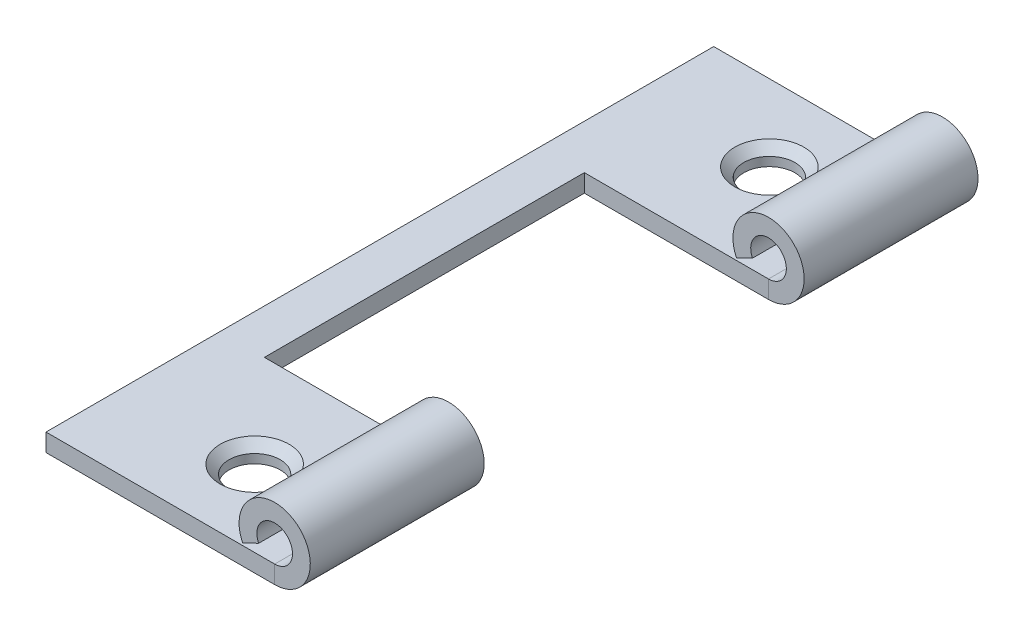
ISO-10303-21;
HEADER;
FILE_DESCRIPTION(('STEP AP214'),'2;1');
FILE_NAME('part.step','',(''),(''),'','','');
FILE_SCHEMA(('AUTOMOTIVE_DESIGN { 1 0 10303 214 1 1 1 1 }'));
ENDSEC;
DATA;
#1=APPLICATION_CONTEXT('core data for automotive mechanical design processes');
#2=APPLICATION_PROTOCOL_DEFINITION('international standard','automotive_design',2000,#1);
#3=PRODUCT_CONTEXT('',#1,'mechanical');
#4=PRODUCT('Part','Part','',(#3));
#5=PRODUCT_RELATED_PRODUCT_CATEGORY('part','',(#4));
#6=PRODUCT_DEFINITION_FORMATION('','',#4);
#7=PRODUCT_DEFINITION_CONTEXT('part definition',#1,'design');
#8=PRODUCT_DEFINITION('design','',#6,#7);
#9=PRODUCT_DEFINITION_SHAPE('','',#8);
#10=(LENGTH_UNIT() NAMED_UNIT(*) SI_UNIT(.MILLI.,.METRE.));
#11=(NAMED_UNIT(*) PLANE_ANGLE_UNIT() SI_UNIT($,.RADIAN.));
#12=(NAMED_UNIT(*) SI_UNIT($,.STERADIAN.) SOLID_ANGLE_UNIT());
#13=UNCERTAINTY_MEASURE_WITH_UNIT(LENGTH_MEASURE(1.E-05),#10,'distance_accuracy_value','');
#14=(GEOMETRIC_REPRESENTATION_CONTEXT(3) GLOBAL_UNCERTAINTY_ASSIGNED_CONTEXT((#13)) GLOBAL_UNIT_ASSIGNED_CONTEXT((#10,
#11,#12)) REPRESENTATION_CONTEXT('',''));
#15=CARTESIAN_POINT('',(0.,0.,0.));
#16=DIRECTION('',(0.,0.,1.));
#17=DIRECTION('',(1.,0.,0.));
#18=AXIS2_PLACEMENT_3D('',#15,#16,#17);
#19=CARTESIAN_POINT('',(-10.00125,2.032,18.25625));
#20=DIRECTION('',(0.,0.,1.));
#21=DIRECTION('',(1.,0.,0.));
#22=AXIS2_PLACEMENT_3D('',#19,#20,#21);
#23=PLANE('',#22);
#24=DIRECTION('',(-1.,0.,0.));
#25=VECTOR('',#24,1.);
#26=CARTESIAN_POINT('',(-10.00125,2.032,18.25625));
#27=LINE('',#26,#25);
#28=CARTESIAN_POINT('',(11.01725,2.032,18.25625));
#29=VERTEX_POINT('',#28);
#30=CARTESIAN_POINT('',(-10.00125,2.032,18.25625));
#31=VERTEX_POINT('',#30);
#32=EDGE_CURVE('E100',#29,#31,#27,.T.);
#33=ORIENTED_EDGE('',*,*,#32,.F.);
#34=DIRECTION('',(0.,-1.,0.));
#35=VECTOR('',#34,1.);
#36=CARTESIAN_POINT('',(11.01725,2.032,18.25625));
#37=LINE('',#36,#35);
#38=CARTESIAN_POINT('',(11.01725,0.,18.25625));
#39=VERTEX_POINT('',#38);
#40=EDGE_CURVE('E228',#29,#39,#37,.T.);
#41=ORIENTED_EDGE('',*,*,#40,.T.);
#42=DIRECTION('',(-1.,0.,0.));
#43=VECTOR('',#42,1.);
#44=CARTESIAN_POINT('',(-10.00125,0.,18.25625));
#45=LINE('',#44,#43);
#46=CARTESIAN_POINT('',(-10.00125,0.,18.25625));
#47=VERTEX_POINT('',#46);
#48=EDGE_CURVE('E278',#39,#47,#45,.T.);
#49=ORIENTED_EDGE('',*,*,#48,.T.);
#50=DIRECTION('',(0.,-1.,0.));
#51=VECTOR('',#50,1.);
#52=CARTESIAN_POINT('',(-10.00125,2.032,18.25625));
#53=LINE('',#52,#51);
#54=EDGE_CURVE('E299',#31,#47,#53,.T.);
#55=ORIENTED_EDGE('',*,*,#54,.F.);
#56=EDGE_LOOP('',(#33,#41,#49,#55));
#57=FACE_BOUND('',#56,.T.);
#58=ADVANCED_FACE('F47',(#57),#23,.F.);
#59=CARTESIAN_POINT('',(-10.00125,2.032,-18.25625));
#60=DIRECTION('',(-1.,0.,0.));
#61=DIRECTION('',(0.,0.,1.));
#62=AXIS2_PLACEMENT_3D('',#59,#60,#61);
#63=PLANE('',#62);
#64=DIRECTION('',(0.,0.,-1.));
#65=VECTOR('',#64,1.);
#66=CARTESIAN_POINT('',(-10.00125,0.,-18.25625));
#67=LINE('',#66,#65);
#68=CARTESIAN_POINT('',(-10.00125,0.,-18.25625));
#69=VERTEX_POINT('',#68);
#70=EDGE_CURVE('E163',#47,#69,#67,.T.);
#71=ORIENTED_EDGE('',*,*,#70,.T.);
#72=DIRECTION('',(0.,-1.,0.));
#73=VECTOR('',#72,1.);
#74=CARTESIAN_POINT('',(-10.00125,2.032,-18.25625));
#75=LINE('',#74,#73);
#76=CARTESIAN_POINT('',(-10.00125,2.032,-18.25625));
#77=VERTEX_POINT('',#76);
#78=EDGE_CURVE('E160',#77,#69,#75,.T.);
#79=ORIENTED_EDGE('',*,*,#78,.F.);
#80=DIRECTION('',(0.,0.,-1.));
#81=VECTOR('',#80,1.);
#82=CARTESIAN_POINT('',(-10.00125,2.032,-18.25625));
#83=LINE('',#82,#81);
#84=EDGE_CURVE('E261',#31,#77,#83,.T.);
#85=ORIENTED_EDGE('',*,*,#84,.F.);
#86=ORIENTED_EDGE('',*,*,#54,.T.);
#87=EDGE_LOOP('',(#71,#79,#85,#86));
#88=FACE_BOUND('',#87,.T.);
#89=ADVANCED_FACE('F349',(#88),#63,.F.);
#90=CARTESIAN_POINT('',(-10.00125,2.032,-18.25625));
#91=DIRECTION('',(0.,0.,-1.));
#92=DIRECTION('',(-1.,0.,0.));
#93=AXIS2_PLACEMENT_3D('',#90,#91,#92);
#94=PLANE('',#93);
#95=DIRECTION('',(1.,0.,0.));
#96=VECTOR('',#95,1.);
#97=CARTESIAN_POINT('',(-10.00125,0.,-18.25625));
#98=LINE('',#97,#96);
#99=CARTESIAN_POINT('',(11.01725,0.,-18.25625));
#100=VERTEX_POINT('',#99);
#101=EDGE_CURVE('E146',#69,#100,#98,.T.);
#102=ORIENTED_EDGE('',*,*,#101,.T.);
#103=DIRECTION('',(0.,-1.,0.));
#104=VECTOR('',#103,1.);
#105=CARTESIAN_POINT('',(11.01725,2.032,-18.25625));
#106=LINE('',#105,#104);
#107=CARTESIAN_POINT('',(11.01725,2.032,-18.25625));
#108=VERTEX_POINT('',#107);
#109=EDGE_CURVE('E152',#108,#100,#106,.T.);
#110=ORIENTED_EDGE('',*,*,#109,.F.);
#111=DIRECTION('',(1.,0.,0.));
#112=VECTOR('',#111,1.);
#113=CARTESIAN_POINT('',(-10.00125,2.032,-18.25625));
#114=LINE('',#113,#112);
#115=EDGE_CURVE('E267',#77,#108,#114,.T.);
#116=ORIENTED_EDGE('',*,*,#115,.F.);
#117=ORIENTED_EDGE('',*,*,#78,.T.);
#118=EDGE_LOOP('',(#102,#110,#116,#117));
#119=FACE_BOUND('',#118,.T.);
#120=ADVANCED_FACE('F151',(#119),#94,.F.);
#121=CARTESIAN_POINT('',(-15.08125,2.032,-38.1));
#122=DIRECTION('',(0.,0.,1.));
#123=DIRECTION('',(1.,0.,0.));
#124=AXIS2_PLACEMENT_3D('',#121,#122,#123);
#125=PLANE('',#124);
#126=DIRECTION('',(-1.,0.,0.));
#127=VECTOR('',#126,1.);
#128=CARTESIAN_POINT('',(-15.08125,2.032,-38.1));
#129=LINE('',#128,#127);
#130=CARTESIAN_POINT('',(11.01725,2.032,-38.1));
#131=VERTEX_POINT('',#130);
#132=CARTESIAN_POINT('',(-15.08125,2.032,-38.1));
#133=VERTEX_POINT('',#132);
#134=EDGE_CURVE('E272',#131,#133,#129,.T.);
#135=ORIENTED_EDGE('',*,*,#134,.F.);
#136=DIRECTION('',(0.,-1.,0.));
#137=VECTOR('',#136,1.);
#138=CARTESIAN_POINT('',(11.01725,2.032,-38.1));
#139=LINE('',#138,#137);
#140=CARTESIAN_POINT('',(11.01725,0.,-38.1));
#141=VERTEX_POINT('',#140);
#142=EDGE_CURVE('E185',#131,#141,#139,.T.);
#143=ORIENTED_EDGE('',*,*,#142,.T.);
#144=DIRECTION('',(-1.,0.,0.));
#145=VECTOR('',#144,1.);
#146=CARTESIAN_POINT('',(-15.08125,0.,-38.1));
#147=LINE('',#146,#145);
#148=CARTESIAN_POINT('',(-15.08125,0.,-38.1));
#149=VERTEX_POINT('',#148);
#150=EDGE_CURVE('E86',#141,#149,#147,.T.);
#151=ORIENTED_EDGE('',*,*,#150,.T.);
#152=DIRECTION('',(0.,-1.,0.));
#153=VECTOR('',#152,1.);
#154=CARTESIAN_POINT('',(-15.08125,2.032,-38.1));
#155=LINE('',#154,#153);
#156=EDGE_CURVE('E295',#133,#149,#155,.T.);
#157=ORIENTED_EDGE('',*,*,#156,.F.);
#158=EDGE_LOOP('',(#135,#143,#151,#157));
#159=FACE_BOUND('',#158,.T.);
#160=ADVANCED_FACE('F370',(#159),#125,.F.);
#161=CARTESIAN_POINT('',(-15.08125,2.032,-38.1));
#162=DIRECTION('',(1.,0.,0.));
#163=DIRECTION('',(0.,0.,-1.));
#164=AXIS2_PLACEMENT_3D('',#161,#162,#163);
#165=PLANE('',#164);
#166=DIRECTION('',(0.,0.,1.));
#167=VECTOR('',#166,1.);
#168=CARTESIAN_POINT('',(-15.08125,0.,-38.1));
#169=LINE('',#168,#167);
#170=CARTESIAN_POINT('',(-15.08125,0.,38.1));
#171=VERTEX_POINT('',#170);
#172=EDGE_CURVE('E95',#149,#171,#169,.T.);
#173=ORIENTED_EDGE('',*,*,#172,.T.);
#174=DIRECTION('',(0.,-1.,0.));
#175=VECTOR('',#174,1.);
#176=CARTESIAN_POINT('',(-15.08125,2.032,38.1));
#177=LINE('',#176,#175);
#178=CARTESIAN_POINT('',(-15.08125,2.032,38.1));
#179=VERTEX_POINT('',#178);
#180=EDGE_CURVE('E276',#179,#171,#177,.T.);
#181=ORIENTED_EDGE('',*,*,#180,.F.);
#182=DIRECTION('',(0.,0.,1.));
#183=VECTOR('',#182,1.);
#184=CARTESIAN_POINT('',(-15.08125,2.032,-38.1));
#185=LINE('',#184,#183);
#186=EDGE_CURVE('E69',#133,#179,#185,.T.);
#187=ORIENTED_EDGE('',*,*,#186,.F.);
#188=ORIENTED_EDGE('',*,*,#156,.T.);
#189=EDGE_LOOP('',(#173,#181,#187,#188));
#190=FACE_BOUND('',#189,.T.);
#191=ADVANCED_FACE('F369',(#190),#165,.F.);
#192=CARTESIAN_POINT('',(-15.08125,2.032,38.1));
#193=DIRECTION('',(0.,0.,-1.));
#194=DIRECTION('',(-1.,0.,0.));
#195=AXIS2_PLACEMENT_3D('',#192,#193,#194);
#196=PLANE('',#195);
#197=DIRECTION('',(1.,0.,0.));
#198=VECTOR('',#197,1.);
#199=CARTESIAN_POINT('',(-15.08125,0.,38.1));
#200=LINE('',#199,#198);
#201=CARTESIAN_POINT('',(11.01725,0.,38.1));
#202=VERTEX_POINT('',#201);
#203=EDGE_CURVE('E263',#171,#202,#200,.T.);
#204=ORIENTED_EDGE('',*,*,#203,.T.);
#205=DIRECTION('',(0.,-1.,0.));
#206=VECTOR('',#205,1.);
#207=CARTESIAN_POINT('',(11.01725,2.032,38.1));
#208=LINE('',#207,#206);
#209=CARTESIAN_POINT('',(11.01725,2.032,38.1));
#210=VERTEX_POINT('',#209);
#211=EDGE_CURVE('E248',#210,#202,#208,.T.);
#212=ORIENTED_EDGE('',*,*,#211,.F.);
#213=DIRECTION('',(1.,0.,0.));
#214=VECTOR('',#213,1.);
#215=CARTESIAN_POINT('',(-15.08125,2.032,38.1));
#216=LINE('',#215,#214);
#217=EDGE_CURVE('E277',#179,#210,#216,.T.);
#218=ORIENTED_EDGE('',*,*,#217,.F.);
#219=ORIENTED_EDGE('',*,*,#180,.T.);
#220=EDGE_LOOP('',(#204,#212,#218,#219));
#221=FACE_BOUND('',#220,.T.);
#222=ADVANCED_FACE('F375',(#221),#196,.F.);
#223=CARTESIAN_POINT('',(0.,2.032,0.));
#224=DIRECTION('',(0.,1.,0.));
#225=DIRECTION('',(0.,0.,1.));
#226=AXIS2_PLACEMENT_3D('',#223,#224,#225);
#227=PLANE('',#226);
#228=CARTESIAN_POINT('',(0.,2.032,-29.36875));
#229=DIRECTION('',(0.,1.,0.));
#230=DIRECTION('',(0.,0.,1.));
#231=AXIS2_PLACEMENT_3D('',#228,#229,#230);
#232=CIRCLE('',#231,3.93699999999999);
#233=CARTESIAN_POINT('',(0.,2.032,-25.43175));
#234=VERTEX_POINT('',#233);
#235=EDGE_CURVE('E58',#234,#234,#232,.F.);
#236=ORIENTED_EDGE('',*,*,#235,.T.);
#237=EDGE_LOOP('',(#236));
#238=FACE_BOUND('',#237,.T.);
#239=CARTESIAN_POINT('',(0.,2.032,29.36875));
#240=DIRECTION('',(0.,1.,0.));
#241=DIRECTION('',(0.,0.,1.));
#242=AXIS2_PLACEMENT_3D('',#239,#240,#241);
#243=CIRCLE('',#242,3.93699999999999);
#244=CARTESIAN_POINT('',(0.,2.032,33.30575));
#245=VERTEX_POINT('',#244);
#246=EDGE_CURVE('E312',#245,#245,#243,.F.);
#247=ORIENTED_EDGE('',*,*,#246,.T.);
#248=EDGE_LOOP('',(#247));
#249=FACE_BOUND('',#248,.T.);
#250=DIRECTION('',(0.,0.,-1.));
#251=VECTOR('',#250,1.);
#252=CARTESIAN_POINT('',(11.01725,2.032,-38.1));
#253=LINE('',#252,#251);
#254=EDGE_CURVE('E196',#131,#108,#253,.F.);
#255=ORIENTED_EDGE('',*,*,#254,.F.);
#256=ORIENTED_EDGE('',*,*,#134,.T.);
#257=ORIENTED_EDGE('',*,*,#186,.T.);
#258=ORIENTED_EDGE('',*,*,#217,.T.);
#259=DIRECTION('',(0.,0.,-1.));
#260=VECTOR('',#259,1.);
#261=CARTESIAN_POINT('',(11.01725,2.032,18.25625));
#262=LINE('',#261,#260);
#263=EDGE_CURVE('E238',#29,#210,#262,.F.);
#264=ORIENTED_EDGE('',*,*,#263,.F.);
#265=ORIENTED_EDGE('',*,*,#32,.T.);
#266=ORIENTED_EDGE('',*,*,#84,.T.);
#267=ORIENTED_EDGE('',*,*,#115,.T.);
#268=EDGE_LOOP('',(#255,#256,#257,#258,#264,#265,#266,#267));
#269=FACE_BOUND('',#268,.T.);
#270=ADVANCED_FACE('F318',(#238,#249,#269),#227,.T.);
#271=CARTESIAN_POINT('',(0.,0.,0.));
#272=DIRECTION('',(0.,1.,0.));
#273=DIRECTION('',(0.,0.,1.));
#274=AXIS2_PLACEMENT_3D('',#271,#272,#273);
#275=PLANE('',#274);
#276=CARTESIAN_POINT('',(0.,0.,-29.36875));
#277=DIRECTION('',(0.,1.,0.));
#278=DIRECTION('',(0.,0.,1.));
#279=AXIS2_PLACEMENT_3D('',#276,#277,#278);
#280=CIRCLE('',#279,2.921);
#281=CARTESIAN_POINT('',(0.,0.,-26.44775));
#282=VERTEX_POINT('',#281);
#283=EDGE_CURVE('E283',#282,#282,#280,.T.);
#284=ORIENTED_EDGE('',*,*,#283,.T.);
#285=EDGE_LOOP('',(#284));
#286=FACE_BOUND('',#285,.T.);
#287=CARTESIAN_POINT('',(0.,0.,29.36875));
#288=DIRECTION('',(0.,1.,0.));
#289=DIRECTION('',(0.,0.,1.));
#290=AXIS2_PLACEMENT_3D('',#287,#288,#289);
#291=CIRCLE('',#290,2.921);
#292=CARTESIAN_POINT('',(0.,0.,32.28975));
#293=VERTEX_POINT('',#292);
#294=EDGE_CURVE('E256',#293,#293,#291,.T.);
#295=ORIENTED_EDGE('',*,*,#294,.T.);
#296=EDGE_LOOP('',(#295));
#297=FACE_BOUND('',#296,.T.);
#298=ORIENTED_EDGE('',*,*,#150,.F.);
#299=DIRECTION('',(0.,0.,-1.));
#300=VECTOR('',#299,1.);
#301=CARTESIAN_POINT('',(11.01725,0.,-38.1));
#302=LINE('',#301,#300);
#303=EDGE_CURVE('E165',#141,#100,#302,.F.);
#304=ORIENTED_EDGE('',*,*,#303,.T.);
#305=ORIENTED_EDGE('',*,*,#101,.F.);
#306=ORIENTED_EDGE('',*,*,#70,.F.);
#307=ORIENTED_EDGE('',*,*,#48,.F.);
#308=DIRECTION('',(0.,0.,-1.));
#309=VECTOR('',#308,1.);
#310=CARTESIAN_POINT('',(11.01725,0.,18.25625));
#311=LINE('',#310,#309);
#312=EDGE_CURVE('E220',#39,#202,#311,.F.);
#313=ORIENTED_EDGE('',*,*,#312,.T.);
#314=ORIENTED_EDGE('',*,*,#203,.F.);
#315=ORIENTED_EDGE('',*,*,#172,.F.);
#316=EDGE_LOOP('',(#298,#304,#305,#306,#307,#313,#314,#315));
#317=FACE_BOUND('',#316,.T.);
#318=ADVANCED_FACE('F164',(#286,#297,#317),#275,.F.);
#319=CARTESIAN_POINT('',(0.,-0.508,29.36875));
#320=DIRECTION('',(0.,1.,0.));
#321=DIRECTION('',(0.,0.,1.));
#322=AXIS2_PLACEMENT_3D('',#319,#320,#321);
#323=CYLINDRICAL_SURFACE('',#322,2.921);
#324=CARTESIAN_POINT('',(0.,1.01600000000001,29.36875));
#325=DIRECTION('',(0.,1.,0.));
#326=DIRECTION('',(0.,0.,1.));
#327=AXIS2_PLACEMENT_3D('',#324,#325,#326);
#328=CIRCLE('',#327,2.921);
#329=CARTESIAN_POINT('',(0.,1.01600000000001,32.28975));
#330=VERTEX_POINT('',#329);
#331=EDGE_CURVE('E11',#330,#330,#328,.T.);
#332=ORIENTED_EDGE('',*,*,#331,.T.);
#333=EDGE_LOOP('',(#332));
#334=FACE_BOUND('',#333,.T.);
#335=ORIENTED_EDGE('',*,*,#294,.F.);
#336=EDGE_LOOP('',(#335));
#337=FACE_BOUND('',#336,.T.);
#338=ADVANCED_FACE('F332',(#334,#337),#323,.F.);
#339=CARTESIAN_POINT('',(0.,-0.508,-29.36875));
#340=DIRECTION('',(0.,1.,0.));
#341=DIRECTION('',(0.,0.,1.));
#342=AXIS2_PLACEMENT_3D('',#339,#340,#341);
#343=CYLINDRICAL_SURFACE('',#342,2.921);
#344=CARTESIAN_POINT('',(0.,1.01600000000001,-29.36875));
#345=DIRECTION('',(0.,1.,0.));
#346=DIRECTION('',(0.,0.,1.));
#347=AXIS2_PLACEMENT_3D('',#344,#345,#346);
#348=CIRCLE('',#347,2.921);
#349=CARTESIAN_POINT('',(0.,1.01600000000001,-26.44775));
#350=VERTEX_POINT('',#349);
#351=EDGE_CURVE('E303',#350,#350,#348,.T.);
#352=ORIENTED_EDGE('',*,*,#351,.T.);
#353=EDGE_LOOP('',(#352));
#354=FACE_BOUND('',#353,.T.);
#355=ORIENTED_EDGE('',*,*,#283,.F.);
#356=EDGE_LOOP('',(#355));
#357=FACE_BOUND('',#356,.T.);
#358=ADVANCED_FACE('F326',(#354,#357),#343,.F.);
#359=CARTESIAN_POINT('',(9.19090049792011,3.17322982972458,28.178125));
#360=DIRECTION('',(-0.438371146789088,0.898794046299162,0.));
#361=DIRECTION('',(0.,0.,-1.));
#362=AXIS2_PLACEMENT_3D('',#359,#360,#361);
#363=PLANE('',#362);
#364=DIRECTION('',(-0.898794046299162,-0.438371146789088,0.));
#365=VECTOR('',#364,1.);
#366=CARTESIAN_POINT('',(9.19090049792011,3.17322982972458,18.25625));
#367=LINE('',#366,#365);
#368=CARTESIAN_POINT('',(9.19090049792011,3.17322982972458,18.25625));
#369=VERTEX_POINT('',#368);
#370=CARTESIAN_POINT('',(7.36455099584022,2.28245965944915,18.25625));
#371=VERTEX_POINT('',#370);
#372=EDGE_CURVE('E257',#369,#371,#367,.T.);
#373=ORIENTED_EDGE('',*,*,#372,.F.);
#374=DIRECTION('',(0.,0.,-1.));
#375=VECTOR('',#374,1.);
#376=CARTESIAN_POINT('',(9.19090049792011,3.17322982972458,18.25625));
#377=LINE('',#376,#375);
#378=CARTESIAN_POINT('',(9.19090049792011,3.17322982972458,38.1));
#379=VERTEX_POINT('',#378);
#380=EDGE_CURVE('E213',#379,#369,#377,.T.);
#381=ORIENTED_EDGE('',*,*,#380,.F.);
#382=DIRECTION('',(-0.898794046299162,-0.438371146789088,0.));
#383=VECTOR('',#382,1.);
#384=CARTESIAN_POINT('',(9.19090049792011,3.17322982972458,38.1));
#385=LINE('',#384,#383);
#386=CARTESIAN_POINT('',(7.36455099584022,2.28245965944915,38.1));
#387=VERTEX_POINT('',#386);
#388=EDGE_CURVE('E254',#379,#387,#385,.T.);
#389=ORIENTED_EDGE('',*,*,#388,.T.);
#390=DIRECTION('',(0.,0.,-1.));
#391=VECTOR('',#390,1.);
#392=CARTESIAN_POINT('',(7.36455099584022,2.28245965944915,18.25625));
#393=LINE('',#392,#391);
#394=EDGE_CURVE('E227',#387,#371,#393,.T.);
#395=ORIENTED_EDGE('',*,*,#394,.T.);
#396=EDGE_LOOP('',(#373,#381,#389,#395));
#397=FACE_BOUND('',#396,.T.);
#398=ADVANCED_FACE('F334',(#397),#363,.F.);
#399=CARTESIAN_POINT('',(11.01725,4.064,38.1));
#400=DIRECTION('',(0.,0.,1.));
#401=DIRECTION('',(1.,0.,0.));
#402=AXIS2_PLACEMENT_3D('',#399,#400,#401);
#403=PLANE('',#402);
#404=ORIENTED_EDGE('',*,*,#388,.F.);
#405=CARTESIAN_POINT('',(11.01725,4.064,38.1));
#406=DIRECTION('',(0.,0.,-1.));
#407=DIRECTION('',(-1.,0.,0.));
#408=AXIS2_PLACEMENT_3D('',#405,#406,#407);
#409=CIRCLE('',#408,2.032);
#410=EDGE_CURVE('E233',#210,#379,#409,.F.);
#411=ORIENTED_EDGE('',*,*,#410,.F.);
#412=ORIENTED_EDGE('',*,*,#211,.T.);
#413=CARTESIAN_POINT('',(11.01725,4.064,38.1));
#414=DIRECTION('',(0.,0.,-1.));
#415=DIRECTION('',(-1.,0.,0.));
#416=AXIS2_PLACEMENT_3D('',#413,#414,#415);
#417=CIRCLE('',#416,4.064);
#418=EDGE_CURVE('E221',#202,#387,#417,.F.);
#419=ORIENTED_EDGE('',*,*,#418,.T.);
#420=EDGE_LOOP('',(#404,#411,#412,#419));
#421=FACE_BOUND('',#420,.T.);
#422=ADVANCED_FACE('F447',(#421),#403,.T.);
#423=CARTESIAN_POINT('',(11.01725,4.064,18.25625));
#424=DIRECTION('',(0.,0.,1.));
#425=DIRECTION('',(1.,0.,0.));
#426=AXIS2_PLACEMENT_3D('',#423,#424,#425);
#427=PLANE('',#426);
#428=CARTESIAN_POINT('',(11.01725,4.064,18.25625));
#429=DIRECTION('',(0.,0.,-1.));
#430=DIRECTION('',(-1.,0.,0.));
#431=AXIS2_PLACEMENT_3D('',#428,#429,#430);
#432=CIRCLE('',#431,2.032);
#433=EDGE_CURVE('E245',#369,#29,#432,.T.);
#434=ORIENTED_EDGE('',*,*,#433,.F.);
#435=ORIENTED_EDGE('',*,*,#372,.T.);
#436=CARTESIAN_POINT('',(11.01725,4.064,18.25625));
#437=DIRECTION('',(0.,0.,-1.));
#438=DIRECTION('',(-1.,0.,0.));
#439=AXIS2_PLACEMENT_3D('',#436,#437,#438);
#440=CIRCLE('',#439,4.064);
#441=EDGE_CURVE('E225',#371,#39,#440,.T.);
#442=ORIENTED_EDGE('',*,*,#441,.T.);
#443=ORIENTED_EDGE('',*,*,#40,.F.);
#444=EDGE_LOOP('',(#434,#435,#442,#443));
#445=FACE_BOUND('',#444,.T.);
#446=ADVANCED_FACE('F440',(#445),#427,.F.);
#447=CARTESIAN_POINT('',(11.01725,4.064,18.25625));
#448=DIRECTION('',(0.,0.,-1.));
#449=DIRECTION('',(-0.898794046299162,-0.438371146789088,0.));
#450=AXIS2_PLACEMENT_3D('',#447,#448,#449);
#451=CYLINDRICAL_SURFACE('',#450,4.064);
#452=ORIENTED_EDGE('',*,*,#312,.F.);
#453=ORIENTED_EDGE('',*,*,#441,.F.);
#454=ORIENTED_EDGE('',*,*,#394,.F.);
#455=ORIENTED_EDGE('',*,*,#418,.F.);
#456=EDGE_LOOP('',(#452,#453,#454,#455));
#457=FACE_BOUND('',#456,.T.);
#458=ADVANCED_FACE('F426',(#457),#451,.T.);
#459=CARTESIAN_POINT('',(11.01725,4.064,18.25625));
#460=DIRECTION('',(0.,0.,-1.));
#461=DIRECTION('',(-0.898794046299162,-0.438371146789088,0.));
#462=AXIS2_PLACEMENT_3D('',#459,#460,#461);
#463=CYLINDRICAL_SURFACE('',#462,2.032);
#464=ORIENTED_EDGE('',*,*,#263,.T.);
#465=ORIENTED_EDGE('',*,*,#410,.T.);
#466=ORIENTED_EDGE('',*,*,#380,.T.);
#467=ORIENTED_EDGE('',*,*,#433,.T.);
#468=EDGE_LOOP('',(#464,#465,#466,#467));
#469=FACE_BOUND('',#468,.T.);
#470=ADVANCED_FACE('F417',(#469),#463,.F.);
#471=CARTESIAN_POINT('',(9.19090049792011,3.17322982972458,-28.178125));
#472=DIRECTION('',(-0.438371146789088,0.898794046299162,0.));
#473=DIRECTION('',(0.,0.,-1.));
#474=AXIS2_PLACEMENT_3D('',#471,#472,#473);
#475=PLANE('',#474);
#476=DIRECTION('',(-0.898794046299162,-0.438371146789088,0.));
#477=VECTOR('',#476,1.);
#478=CARTESIAN_POINT('',(9.19090049792011,3.17322982972458,-38.1));
#479=LINE('',#478,#477);
#480=CARTESIAN_POINT('',(9.19090049792011,3.17322982972458,-38.1));
#481=VERTEX_POINT('',#480);
#482=CARTESIAN_POINT('',(7.36455099584021,2.28245965944915,-38.1));
#483=VERTEX_POINT('',#482);
#484=EDGE_CURVE('E214',#481,#483,#479,.T.);
#485=ORIENTED_EDGE('',*,*,#484,.F.);
#486=DIRECTION('',(0.,0.,-1.));
#487=VECTOR('',#486,1.);
#488=CARTESIAN_POINT('',(9.19090049792011,3.17322982972458,-38.1));
#489=LINE('',#488,#487);
#490=CARTESIAN_POINT('',(9.19090049792011,3.17322982972458,-18.25625));
#491=VERTEX_POINT('',#490);
#492=EDGE_CURVE('E210',#491,#481,#489,.T.);
#493=ORIENTED_EDGE('',*,*,#492,.F.);
#494=DIRECTION('',(-0.898794046299162,-0.438371146789088,0.));
#495=VECTOR('',#494,1.);
#496=CARTESIAN_POINT('',(9.19090049792011,3.17322982972458,-18.25625));
#497=LINE('',#496,#495);
#498=CARTESIAN_POINT('',(7.36455099584021,2.28245965944915,-18.25625));
#499=VERTEX_POINT('',#498);
#500=EDGE_CURVE('E181',#491,#499,#497,.T.);
#501=ORIENTED_EDGE('',*,*,#500,.T.);
#502=DIRECTION('',(0.,0.,-1.));
#503=VECTOR('',#502,1.);
#504=CARTESIAN_POINT('',(7.36455099584021,2.28245965944915,-38.1));
#505=LINE('',#504,#503);
#506=EDGE_CURVE('E190',#499,#483,#505,.T.);
#507=ORIENTED_EDGE('',*,*,#506,.T.);
#508=EDGE_LOOP('',(#485,#493,#501,#507));
#509=FACE_BOUND('',#508,.T.);
#510=ADVANCED_FACE('F411',(#509),#475,.F.);
#511=CARTESIAN_POINT('',(11.01725,4.064,-18.25625));
#512=DIRECTION('',(0.,0.,1.));
#513=DIRECTION('',(1.,0.,0.));
#514=AXIS2_PLACEMENT_3D('',#511,#512,#513);
#515=PLANE('',#514);
#516=ORIENTED_EDGE('',*,*,#500,.F.);
#517=CARTESIAN_POINT('',(11.01725,4.064,-18.25625));
#518=DIRECTION('',(0.,0.,-1.));
#519=DIRECTION('',(-1.,0.,0.));
#520=AXIS2_PLACEMENT_3D('',#517,#518,#519);
#521=CIRCLE('',#520,2.032);
#522=EDGE_CURVE('E177',#108,#491,#521,.F.);
#523=ORIENTED_EDGE('',*,*,#522,.F.);
#524=ORIENTED_EDGE('',*,*,#109,.T.);
#525=CARTESIAN_POINT('',(11.01725,4.064,-18.25625));
#526=DIRECTION('',(0.,0.,-1.));
#527=DIRECTION('',(-1.,0.,0.));
#528=AXIS2_PLACEMENT_3D('',#525,#526,#527);
#529=CIRCLE('',#528,4.064);
#530=EDGE_CURVE('E171',#100,#499,#529,.F.);
#531=ORIENTED_EDGE('',*,*,#530,.T.);
#532=EDGE_LOOP('',(#516,#523,#524,#531));
#533=FACE_BOUND('',#532,.T.);
#534=ADVANCED_FACE('F180',(#533),#515,.T.);
#535=CARTESIAN_POINT('',(11.01725,4.064,-38.1));
#536=DIRECTION('',(0.,0.,1.));
#537=DIRECTION('',(1.,0.,0.));
#538=AXIS2_PLACEMENT_3D('',#535,#536,#537);
#539=PLANE('',#538);
#540=CARTESIAN_POINT('',(11.01725,4.064,-38.1));
#541=DIRECTION('',(0.,0.,-1.));
#542=DIRECTION('',(-1.,0.,0.));
#543=AXIS2_PLACEMENT_3D('',#540,#541,#542);
#544=CIRCLE('',#543,2.032);
#545=EDGE_CURVE('E202',#481,#131,#544,.T.);
#546=ORIENTED_EDGE('',*,*,#545,.F.);
#547=ORIENTED_EDGE('',*,*,#484,.T.);
#548=CARTESIAN_POINT('',(11.01725,4.064,-38.1));
#549=DIRECTION('',(0.,0.,-1.));
#550=DIRECTION('',(-1.,0.,0.));
#551=AXIS2_PLACEMENT_3D('',#548,#549,#550);
#552=CIRCLE('',#551,4.064);
#553=EDGE_CURVE('E175',#483,#141,#552,.T.);
#554=ORIENTED_EDGE('',*,*,#553,.T.);
#555=ORIENTED_EDGE('',*,*,#142,.F.);
#556=EDGE_LOOP('',(#546,#547,#554,#555));
#557=FACE_BOUND('',#556,.T.);
#558=ADVANCED_FACE('F393',(#557),#539,.F.);
#559=CARTESIAN_POINT('',(11.01725,4.064,-38.1));
#560=DIRECTION('',(0.,0.,-1.));
#561=DIRECTION('',(-0.898794046299162,-0.438371146789088,0.));
#562=AXIS2_PLACEMENT_3D('',#559,#560,#561);
#563=CYLINDRICAL_SURFACE('',#562,4.064);
#564=ORIENTED_EDGE('',*,*,#303,.F.);
#565=ORIENTED_EDGE('',*,*,#553,.F.);
#566=ORIENTED_EDGE('',*,*,#506,.F.);
#567=ORIENTED_EDGE('',*,*,#530,.F.);
#568=EDGE_LOOP('',(#564,#565,#566,#567));
#569=FACE_BOUND('',#568,.T.);
#570=ADVANCED_FACE('F184',(#569),#563,.T.);
#571=CARTESIAN_POINT('',(11.01725,4.064,-38.1));
#572=DIRECTION('',(0.,0.,-1.));
#573=DIRECTION('',(-0.898794046299162,-0.438371146789088,0.));
#574=AXIS2_PLACEMENT_3D('',#571,#572,#573);
#575=CYLINDRICAL_SURFACE('',#574,2.032);
#576=ORIENTED_EDGE('',*,*,#254,.T.);
#577=ORIENTED_EDGE('',*,*,#522,.T.);
#578=ORIENTED_EDGE('',*,*,#492,.T.);
#579=ORIENTED_EDGE('',*,*,#545,.T.);
#580=EDGE_LOOP('',(#576,#577,#578,#579));
#581=FACE_BOUND('',#580,.T.);
#582=ADVANCED_FACE('F327',(#581),#575,.F.);
#583=CARTESIAN_POINT('',(0.,1.01600000000001,-29.36875));
#584=DIRECTION('',(0.,1.,0.));
#585=DIRECTION('',(0.,0.,1.));
#586=AXIS2_PLACEMENT_3D('',#583,#584,#585);
#587=CONICAL_SURFACE('',#586,2.921,0.785398163397448);
#588=ORIENTED_EDGE('',*,*,#235,.F.);
#589=EDGE_LOOP('',(#588));
#590=FACE_BOUND('',#589,.T.);
#591=ORIENTED_EDGE('',*,*,#351,.F.);
#592=EDGE_LOOP('',(#591));
#593=FACE_BOUND('',#592,.T.);
#594=ADVANCED_FACE('F324',(#590,#593),#587,.F.);
#595=CARTESIAN_POINT('',(0.,1.01600000000001,29.36875));
#596=DIRECTION('',(0.,1.,0.));
#597=DIRECTION('',(0.,0.,1.));
#598=AXIS2_PLACEMENT_3D('',#595,#596,#597);
#599=CONICAL_SURFACE('',#598,2.921,0.78539816339745);
#600=ORIENTED_EDGE('',*,*,#246,.F.);
#601=EDGE_LOOP('',(#600));
#602=FACE_BOUND('',#601,.T.);
#603=ORIENTED_EDGE('',*,*,#331,.F.);
#604=EDGE_LOOP('',(#603));
#605=FACE_BOUND('',#604,.T.);
#606=ADVANCED_FACE('F55',(#602,#605),#599,.F.);
#607=CLOSED_SHELL('',(#58,#89,#120,#160,#191,#222,#270,#318,#338,#358,#398,#422,#446,#458,#470,
#510,#534,#558,#570,#582,#594,#606));
#608=MANIFOLD_SOLID_BREP('B2',#607);
#609=ADVANCED_BREP_SHAPE_REPRESENTATION('',(#18,#608),#14);
#610=SHAPE_DEFINITION_REPRESENTATION(#9,#609);
ENDSEC;
END-ISO-10303-21;
